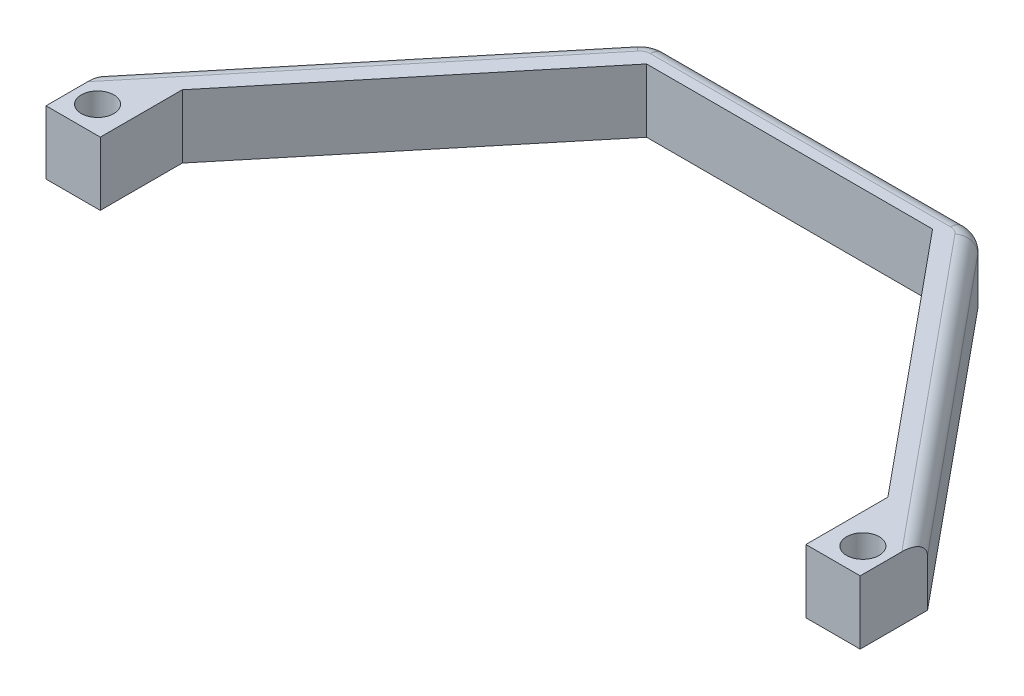
ISO-10303-21;
HEADER;
FILE_DESCRIPTION(('STEP AP214'),'2;1');
FILE_NAME('part.step','',(''),(''),'','','');
FILE_SCHEMA(('AUTOMOTIVE_DESIGN { 1 0 10303 214 1 1 1 1 }'));
ENDSEC;
DATA;
#1=APPLICATION_CONTEXT('core data for automotive mechanical design processes');
#2=APPLICATION_PROTOCOL_DEFINITION('international standard','automotive_design',2000,#1);
#3=PRODUCT_CONTEXT('',#1,'mechanical');
#4=PRODUCT('Part','Part','',(#3));
#5=PRODUCT_RELATED_PRODUCT_CATEGORY('part','',(#4));
#6=PRODUCT_DEFINITION_FORMATION('','',#4);
#7=PRODUCT_DEFINITION_CONTEXT('part definition',#1,'design');
#8=PRODUCT_DEFINITION('design','',#6,#7);
#9=PRODUCT_DEFINITION_SHAPE('','',#8);
#10=(LENGTH_UNIT() NAMED_UNIT(*) SI_UNIT(.MILLI.,.METRE.));
#11=(NAMED_UNIT(*) PLANE_ANGLE_UNIT() SI_UNIT($,.RADIAN.));
#12=(NAMED_UNIT(*) SI_UNIT($,.STERADIAN.) SOLID_ANGLE_UNIT());
#13=UNCERTAINTY_MEASURE_WITH_UNIT(LENGTH_MEASURE(1.E-05),#10,'distance_accuracy_value','');
#14=(GEOMETRIC_REPRESENTATION_CONTEXT(3) GLOBAL_UNCERTAINTY_ASSIGNED_CONTEXT((#13)) GLOBAL_UNIT_ASSIGNED_CONTEXT((#10,
#11,#12)) REPRESENTATION_CONTEXT('',''));
#15=CARTESIAN_POINT('',(0.,0.,0.));
#16=DIRECTION('',(0.,0.,1.));
#17=DIRECTION('',(1.,0.,0.));
#18=AXIS2_PLACEMENT_3D('',#15,#16,#17);
#19=CARTESIAN_POINT('',(70.5,11.7,-5.));
#20=DIRECTION('',(0.,-1.,0.));
#21=DIRECTION('',(0.,0.,-1.));
#22=AXIS2_PLACEMENT_3D('',#19,#20,#21);
#23=CYLINDRICAL_SURFACE('',#22,1.65);
#24=CARTESIAN_POINT('',(70.5,0.,-5.));
#25=DIRECTION('',(0.,1.,0.));
#26=DIRECTION('',(0.,0.,1.));
#27=AXIS2_PLACEMENT_3D('',#24,#25,#26);
#28=CIRCLE('',#27,1.65);
#29=CARTESIAN_POINT('',(70.5,0.,-3.35));
#30=VERTEX_POINT('',#29);
#31=EDGE_CURVE('E204',#30,#30,#28,.T.);
#32=ORIENTED_EDGE('',*,*,#31,.F.);
#33=EDGE_LOOP('',(#32));
#34=FACE_BOUND('',#33,.T.);
#35=CARTESIAN_POINT('',(70.5,6.,-5.));
#36=DIRECTION('',(0.,1.,0.));
#37=DIRECTION('',(0.,0.,1.));
#38=AXIS2_PLACEMENT_3D('',#35,#36,#37);
#39=CIRCLE('',#38,1.65);
#40=CARTESIAN_POINT('',(70.5,6.,-3.35));
#41=VERTEX_POINT('',#40);
#42=EDGE_CURVE('E43',#41,#41,#39,.T.);
#43=ORIENTED_EDGE('',*,*,#42,.T.);
#44=EDGE_LOOP('',(#43));
#45=FACE_BOUND('',#44,.T.);
#46=ADVANCED_FACE('F39',(#34,#45),#23,.F.);
#47=CARTESIAN_POINT('',(-70.5,11.7,-5.));
#48=DIRECTION('',(0.,-1.,0.));
#49=DIRECTION('',(0.,0.,-1.));
#50=AXIS2_PLACEMENT_3D('',#47,#48,#49);
#51=CYLINDRICAL_SURFACE('',#50,1.65);
#52=CARTESIAN_POINT('',(-70.5,0.,-5.));
#53=DIRECTION('',(0.,1.,0.));
#54=DIRECTION('',(0.,0.,1.));
#55=AXIS2_PLACEMENT_3D('',#52,#53,#54);
#56=CIRCLE('',#55,1.65);
#57=CARTESIAN_POINT('',(-70.5,0.,-3.35));
#58=VERTEX_POINT('',#57);
#59=EDGE_CURVE('E207',#58,#58,#56,.T.);
#60=ORIENTED_EDGE('',*,*,#59,.F.);
#61=EDGE_LOOP('',(#60));
#62=FACE_BOUND('',#61,.T.);
#63=CARTESIAN_POINT('',(-70.5,6.,-5.));
#64=DIRECTION('',(0.,1.,0.));
#65=DIRECTION('',(0.,0.,1.));
#66=AXIS2_PLACEMENT_3D('',#63,#64,#65);
#67=CIRCLE('',#66,1.65);
#68=CARTESIAN_POINT('',(-70.5,6.,-3.35));
#69=VERTEX_POINT('',#68);
#70=EDGE_CURVE('E272',#69,#69,#67,.T.);
#71=ORIENTED_EDGE('',*,*,#70,.T.);
#72=EDGE_LOOP('',(#71));
#73=FACE_BOUND('',#72,.T.);
#74=ADVANCED_FACE('F396',(#62,#73),#51,.F.);
#75=CARTESIAN_POINT('',(0.,11.7,0.));
#76=DIRECTION('',(0.,1.,0.));
#77=DIRECTION('',(0.,0.,1.));
#78=AXIS2_PLACEMENT_3D('',#75,#76,#77);
#79=PLANE('',#78);
#80=CARTESIAN_POINT('',(-70.5,11.7,-5.));
#81=DIRECTION('',(0.,1.,0.));
#82=DIRECTION('',(0.,0.,1.));
#83=AXIS2_PLACEMENT_3D('',#80,#81,#82);
#84=CIRCLE('',#83,3.00000000000001);
#85=CARTESIAN_POINT('',(-70.5,11.7,-1.99999999999999));
#86=VERTEX_POINT('',#85);
#87=EDGE_CURVE('E279',#86,#86,#84,.T.);
#88=ORIENTED_EDGE('',*,*,#87,.F.);
#89=EDGE_LOOP('',(#88));
#90=FACE_BOUND('',#89,.T.);
#91=CARTESIAN_POINT('',(70.5,11.7,-5.));
#92=DIRECTION('',(0.,1.,0.));
#93=DIRECTION('',(0.,0.,1.));
#94=AXIS2_PLACEMENT_3D('',#91,#92,#93);
#95=CIRCLE('',#94,3.00000000000001);
#96=CARTESIAN_POINT('',(70.5,11.7,-1.99999999999999));
#97=VERTEX_POINT('',#96);
#98=EDGE_CURVE('E287',#97,#97,#95,.T.);
#99=ORIENTED_EDGE('',*,*,#98,.F.);
#100=EDGE_LOOP('',(#99));
#101=FACE_BOUND('',#100,.T.);
#102=CARTESIAN_POINT('',(27.6418249587765,11.7,-62.));
#103=DIRECTION('',(0.,1.,0.));
#104=DIRECTION('',(0.,0.,1.));
#105=AXIS2_PLACEMENT_3D('',#102,#103,#104);
#106=CIRCLE('',#105,2.);
#107=CARTESIAN_POINT('',(27.6418249587765,11.7,-64.));
#108=VERTEX_POINT('',#107);
#109=CARTESIAN_POINT('',(29.1850832615161,11.7,-63.2721453576637));
#110=VERTEX_POINT('',#109);
#111=EDGE_CURVE('E252',#108,#110,#106,.F.);
#112=ORIENTED_EDGE('',*,*,#111,.F.);
#113=DIRECTION('',(1.,0.,0.));
#114=VECTOR('',#113,1.);
#115=CARTESIAN_POINT('',(0.,11.7,-64.));
#116=LINE('',#115,#114);
#117=CARTESIAN_POINT('',(-27.6418249587765,11.7,-64.));
#118=VERTEX_POINT('',#117);
#119=EDGE_CURVE('E231',#108,#118,#116,.F.);
#120=ORIENTED_EDGE('',*,*,#119,.T.);
#121=CARTESIAN_POINT('',(-27.6418249587765,11.7,-62.));
#122=DIRECTION('',(0.,1.,0.));
#123=DIRECTION('',(0.,0.,1.));
#124=AXIS2_PLACEMENT_3D('',#121,#122,#123);
#125=CIRCLE('',#124,2.);
#126=CARTESIAN_POINT('',(-29.1850832615161,11.7,-63.2721453576637));
#127=VERTEX_POINT('',#126);
#128=EDGE_CURVE('E250',#127,#118,#125,.F.);
#129=ORIENTED_EDGE('',*,*,#128,.F.);
#130=DIRECTION('',(0.636072678831856,0.,-0.771629151369793));
#131=VECTOR('',#130,1.);
#132=CARTESIAN_POINT('',(-48.4318777954285,11.7,-39.9235749394748));
#133=LINE('',#132,#131);
#134=CARTESIAN_POINT('',(-75.,11.7,-7.69339390442093));
#135=VERTEX_POINT('',#134);
#136=EDGE_CURVE('E237',#127,#135,#133,.F.);
#137=ORIENTED_EDGE('',*,*,#136,.T.);
#138=DIRECTION('',(0.,0.,1.));
#139=VECTOR('',#138,1.);
#140=CARTESIAN_POINT('',(-75.,11.7,0.));
#141=LINE('',#140,#139);
#142=CARTESIAN_POINT('',(-75.,11.7,0.));
#143=VERTEX_POINT('',#142);
#144=EDGE_CURVE('E215',#135,#143,#141,.T.);
#145=ORIENTED_EDGE('',*,*,#144,.T.);
#146=DIRECTION('',(-1.,0.,0.));
#147=VECTOR('',#146,1.);
#148=CARTESIAN_POINT('',(0.,11.7,0.));
#149=LINE('',#148,#147);
#150=CARTESIAN_POINT('',(-65.,11.7,0.));
#151=VERTEX_POINT('',#150);
#152=EDGE_CURVE('E210',#151,#143,#149,.T.);
#153=ORIENTED_EDGE('',*,*,#152,.F.);
#154=DIRECTION('',(0.,0.,-1.));
#155=VECTOR('',#154,1.);
#156=CARTESIAN_POINT('',(-65.,11.7,0.));
#157=LINE('',#156,#155);
#158=CARTESIAN_POINT('',(-65.,11.7,-15.1080992842517));
#159=VERTEX_POINT('',#158);
#160=EDGE_CURVE('E192',#151,#159,#157,.T.);
#161=ORIENTED_EDGE('',*,*,#160,.T.);
#162=DIRECTION('',(0.636072678831856,0.,-0.771629151369793));
#163=VECTOR('',#162,1.);
#164=CARTESIAN_POINT('',(-46.1169903413192,11.7,-38.0153569029793));
#165=LINE('',#164,#163);
#166=CARTESIAN_POINT('',(-26.3458656262075,11.7,-62.));
#167=VERTEX_POINT('',#166);
#168=EDGE_CURVE('E312',#159,#167,#165,.T.);
#169=ORIENTED_EDGE('',*,*,#168,.T.);
#170=DIRECTION('',(1.,0.,0.));
#171=VECTOR('',#170,1.);
#172=CARTESIAN_POINT('',(0.,11.7,-62.));
#173=LINE('',#172,#171);
#174=CARTESIAN_POINT('',(26.3458656262075,11.7,-62.));
#175=VERTEX_POINT('',#174);
#176=EDGE_CURVE('E309',#167,#175,#173,.T.);
#177=ORIENTED_EDGE('',*,*,#176,.T.);
#178=DIRECTION('',(-0.636072678831856,0.,-0.771629151369793));
#179=VECTOR('',#178,1.);
#180=CARTESIAN_POINT('',(46.1169903413192,11.7,-38.0153569029793));
#181=LINE('',#180,#179);
#182=CARTESIAN_POINT('',(65.,11.7,-15.1080992842517));
#183=VERTEX_POINT('',#182);
#184=EDGE_CURVE('E307',#183,#175,#181,.T.);
#185=ORIENTED_EDGE('',*,*,#184,.F.);
#186=DIRECTION('',(0.,0.,-1.));
#187=VECTOR('',#186,1.);
#188=CARTESIAN_POINT('',(65.,11.7,0.));
#189=LINE('',#188,#187);
#190=CARTESIAN_POINT('',(65.,11.7,0.));
#191=VERTEX_POINT('',#190);
#192=EDGE_CURVE('E295',#191,#183,#189,.T.);
#193=ORIENTED_EDGE('',*,*,#192,.F.);
#194=DIRECTION('',(-1.,0.,0.));
#195=VECTOR('',#194,1.);
#196=CARTESIAN_POINT('',(0.,11.7,0.));
#197=LINE('',#196,#195);
#198=CARTESIAN_POINT('',(75.,11.7,0.));
#199=VERTEX_POINT('',#198);
#200=EDGE_CURVE('E181',#199,#191,#197,.T.);
#201=ORIENTED_EDGE('',*,*,#200,.F.);
#202=DIRECTION('',(0.,0.,1.));
#203=VECTOR('',#202,1.);
#204=CARTESIAN_POINT('',(75.,11.7,0.));
#205=LINE('',#204,#203);
#206=CARTESIAN_POINT('',(75.,11.7,-7.69339390442094));
#207=VERTEX_POINT('',#206);
#208=EDGE_CURVE('E320',#207,#199,#205,.T.);
#209=ORIENTED_EDGE('',*,*,#208,.F.);
#210=DIRECTION('',(0.636072678831856,0.,0.771629151369793));
#211=VECTOR('',#210,1.);
#212=CARTESIAN_POINT('',(48.4318777954285,11.7,-39.9235749394748));
#213=LINE('',#212,#211);
#214=EDGE_CURVE('E234',#207,#110,#213,.F.);
#215=ORIENTED_EDGE('',*,*,#214,.T.);
#216=EDGE_LOOP('',(#112,#120,#129,#137,#145,#153,#161,#169,#177,#185,#193,#201,#209,#215));
#217=FACE_BOUND('',#216,.T.);
#218=ADVANCED_FACE('F324',(#90,#101,#217),#79,.T.);
#219=CARTESIAN_POINT('',(0.,11.7,0.));
#220=DIRECTION('',(0.,0.,1.));
#221=DIRECTION('',(1.,0.,0.));
#222=AXIS2_PLACEMENT_3D('',#219,#220,#221);
#223=PLANE('',#222);
#224=DIRECTION('',(-1.,0.,0.));
#225=VECTOR('',#224,1.);
#226=CARTESIAN_POINT('',(0.,0.,0.));
#227=LINE('',#226,#225);
#228=CARTESIAN_POINT('',(-65.,0.,0.));
#229=VERTEX_POINT('',#228);
#230=CARTESIAN_POINT('',(-75.,0.,0.));
#231=VERTEX_POINT('',#230);
#232=EDGE_CURVE('E188',#229,#231,#227,.T.);
#233=ORIENTED_EDGE('',*,*,#232,.F.);
#234=DIRECTION('',(0.,1.,0.));
#235=VECTOR('',#234,1.);
#236=CARTESIAN_POINT('',(-65.,-10.,0.));
#237=LINE('',#236,#235);
#238=EDGE_CURVE('E292',#229,#151,#237,.T.);
#239=ORIENTED_EDGE('',*,*,#238,.T.);
#240=ORIENTED_EDGE('',*,*,#152,.T.);
#241=DIRECTION('',(0.,-1.,0.));
#242=VECTOR('',#241,1.);
#243=CARTESIAN_POINT('',(-75.,11.7,0.));
#244=LINE('',#243,#242);
#245=EDGE_CURVE('E211',#143,#231,#244,.T.);
#246=ORIENTED_EDGE('',*,*,#245,.T.);
#247=EDGE_LOOP('',(#233,#239,#240,#246));
#248=FACE_BOUND('',#247,.T.);
#249=ADVANCED_FACE('F331',(#248),#223,.T.);
#250=CARTESIAN_POINT('',(0.,0.,0.));
#251=DIRECTION('',(0.,1.,0.));
#252=DIRECTION('',(0.,0.,1.));
#253=AXIS2_PLACEMENT_3D('',#250,#251,#252);
#254=PLANE('',#253);
#255=ORIENTED_EDGE('',*,*,#59,.T.);
#256=EDGE_LOOP('',(#255));
#257=FACE_BOUND('',#256,.T.);
#258=ORIENTED_EDGE('',*,*,#31,.T.);
#259=EDGE_LOOP('',(#258));
#260=FACE_BOUND('',#259,.T.);
#261=DIRECTION('',(0.636072678831856,0.,-0.771629151369793));
#262=VECTOR('',#261,1.);
#263=CARTESIAN_POINT('',(-50.7467652495379,0.,-41.8317929759704));
#264=LINE('',#263,#262);
#265=CARTESIAN_POINT('',(-75.,0.,-12.4098360655738));
#266=VERTEX_POINT('',#265);
#267=CARTESIAN_POINT('',(-31.4999707156255,0.,-65.1803633941593));
#268=VERTEX_POINT('',#267);
#269=EDGE_CURVE('E199',#266,#268,#264,.T.);
#270=ORIENTED_EDGE('',*,*,#269,.T.);
#271=CARTESIAN_POINT('',(-27.6418249587765,0.,-62.));
#272=DIRECTION('',(0.,1.,0.));
#273=DIRECTION('',(0.,0.,1.));
#274=AXIS2_PLACEMENT_3D('',#271,#272,#273);
#275=CIRCLE('',#274,5.);
#276=CARTESIAN_POINT('',(-27.6418249587765,0.,-67.));
#277=VERTEX_POINT('',#276);
#278=EDGE_CURVE('E262',#268,#277,#275,.F.);
#279=ORIENTED_EDGE('',*,*,#278,.T.);
#280=DIRECTION('',(1.,0.,0.));
#281=VECTOR('',#280,1.);
#282=CARTESIAN_POINT('',(0.,0.,-67.));
#283=LINE('',#282,#281);
#284=CARTESIAN_POINT('',(27.6418249587765,0.,-67.));
#285=VERTEX_POINT('',#284);
#286=EDGE_CURVE('E197',#277,#285,#283,.T.);
#287=ORIENTED_EDGE('',*,*,#286,.T.);
#288=CARTESIAN_POINT('',(27.6418249587765,0.,-62.));
#289=DIRECTION('',(0.,1.,0.));
#290=DIRECTION('',(0.,0.,1.));
#291=AXIS2_PLACEMENT_3D('',#288,#289,#290);
#292=CIRCLE('',#291,5.);
#293=CARTESIAN_POINT('',(31.4999707156255,0.,-65.1803633941593));
#294=VERTEX_POINT('',#293);
#295=EDGE_CURVE('E56',#285,#294,#292,.F.);
#296=ORIENTED_EDGE('',*,*,#295,.T.);
#297=DIRECTION('',(0.636072678831856,0.,0.771629151369793));
#298=VECTOR('',#297,1.);
#299=CARTESIAN_POINT('',(50.7467652495379,0.,-41.8317929759704));
#300=LINE('',#299,#298);
#301=CARTESIAN_POINT('',(75.,0.,-12.4098360655738));
#302=VERTEX_POINT('',#301);
#303=EDGE_CURVE('E190',#294,#302,#300,.T.);
#304=ORIENTED_EDGE('',*,*,#303,.T.);
#305=DIRECTION('',(0.,0.,1.));
#306=VECTOR('',#305,1.);
#307=CARTESIAN_POINT('',(75.,0.,0.));
#308=LINE('',#307,#306);
#309=CARTESIAN_POINT('',(75.,0.,0.));
#310=VERTEX_POINT('',#309);
#311=EDGE_CURVE('E187',#302,#310,#308,.T.);
#312=ORIENTED_EDGE('',*,*,#311,.T.);
#313=DIRECTION('',(-1.,0.,0.));
#314=VECTOR('',#313,1.);
#315=CARTESIAN_POINT('',(0.,0.,0.));
#316=LINE('',#315,#314);
#317=CARTESIAN_POINT('',(65.,0.,0.));
#318=VERTEX_POINT('',#317);
#319=EDGE_CURVE('E178',#310,#318,#316,.T.);
#320=ORIENTED_EDGE('',*,*,#319,.T.);
#321=DIRECTION('',(0.,0.,-1.));
#322=VECTOR('',#321,1.);
#323=CARTESIAN_POINT('',(65.,0.,0.));
#324=LINE('',#323,#322);
#325=CARTESIAN_POINT('',(65.,0.,-15.1080992842517));
#326=VERTEX_POINT('',#325);
#327=EDGE_CURVE('E160',#318,#326,#324,.T.);
#328=ORIENTED_EDGE('',*,*,#327,.T.);
#329=DIRECTION('',(-0.636072678831856,0.,-0.771629151369793));
#330=VECTOR('',#329,1.);
#331=CARTESIAN_POINT('',(46.1169903413192,0.,-38.0153569029793));
#332=LINE('',#331,#330);
#333=CARTESIAN_POINT('',(26.3458656262075,0.,-62.));
#334=VERTEX_POINT('',#333);
#335=EDGE_CURVE('E170',#326,#334,#332,.T.);
#336=ORIENTED_EDGE('',*,*,#335,.T.);
#337=DIRECTION('',(1.,0.,0.));
#338=VECTOR('',#337,1.);
#339=CARTESIAN_POINT('',(0.,0.,-62.));
#340=LINE('',#339,#338);
#341=CARTESIAN_POINT('',(-26.3458656262075,0.,-62.));
#342=VERTEX_POINT('',#341);
#343=EDGE_CURVE('E222',#342,#334,#340,.T.);
#344=ORIENTED_EDGE('',*,*,#343,.F.);
#345=DIRECTION('',(0.636072678831856,0.,-0.771629151369793));
#346=VECTOR('',#345,1.);
#347=CARTESIAN_POINT('',(-46.1169903413192,0.,-38.0153569029793));
#348=LINE('',#347,#346);
#349=CARTESIAN_POINT('',(-65.,0.,-15.1080992842517));
#350=VERTEX_POINT('',#349);
#351=EDGE_CURVE('E224',#350,#342,#348,.T.);
#352=ORIENTED_EDGE('',*,*,#351,.F.);
#353=DIRECTION('',(0.,0.,-1.));
#354=VECTOR('',#353,1.);
#355=CARTESIAN_POINT('',(-65.,0.,0.));
#356=LINE('',#355,#354);
#357=EDGE_CURVE('E226',#229,#350,#356,.T.);
#358=ORIENTED_EDGE('',*,*,#357,.F.);
#359=ORIENTED_EDGE('',*,*,#232,.T.);
#360=DIRECTION('',(0.,0.,1.));
#361=VECTOR('',#360,1.);
#362=CARTESIAN_POINT('',(-75.,0.,0.));
#363=LINE('',#362,#361);
#364=EDGE_CURVE('E201',#266,#231,#363,.T.);
#365=ORIENTED_EDGE('',*,*,#364,.F.);
#366=EDGE_LOOP('',(#270,#279,#287,#296,#304,#312,#320,#328,#336,#344,#352,#358,#359,#365));
#367=FACE_BOUND('',#366,.T.);
#368=ADVANCED_FACE('F185',(#257,#260,#367),#254,.F.);
#369=CARTESIAN_POINT('',(0.,11.7,0.));
#370=DIRECTION('',(0.,0.,1.));
#371=DIRECTION('',(1.,0.,0.));
#372=AXIS2_PLACEMENT_3D('',#369,#370,#371);
#373=PLANE('',#372);
#374=DIRECTION('',(0.,1.,0.));
#375=VECTOR('',#374,1.);
#376=CARTESIAN_POINT('',(65.,-10.,0.));
#377=LINE('',#376,#375);
#378=EDGE_CURVE('E163',#318,#191,#377,.T.);
#379=ORIENTED_EDGE('',*,*,#378,.F.);
#380=ORIENTED_EDGE('',*,*,#319,.F.);
#381=DIRECTION('',(0.,-1.,0.));
#382=VECTOR('',#381,1.);
#383=CARTESIAN_POINT('',(75.,11.7,0.));
#384=LINE('',#383,#382);
#385=EDGE_CURVE('E171',#199,#310,#384,.T.);
#386=ORIENTED_EDGE('',*,*,#385,.F.);
#387=ORIENTED_EDGE('',*,*,#200,.T.);
#388=EDGE_LOOP('',(#379,#380,#386,#387));
#389=FACE_BOUND('',#388,.T.);
#390=ADVANCED_FACE('F176',(#389),#373,.T.);
#391=CARTESIAN_POINT('',(75.,11.7,0.));
#392=DIRECTION('',(1.,0.,0.));
#393=DIRECTION('',(0.,0.,-1.));
#394=AXIS2_PLACEMENT_3D('',#391,#392,#393);
#395=PLANE('',#394);
#396=DIRECTION('',(0.,-1.,0.));
#397=VECTOR('',#396,1.);
#398=CARTESIAN_POINT('',(75.,11.7,-12.4098360655738));
#399=LINE('',#398,#397);
#400=CARTESIAN_POINT('',(75.,8.7,-12.4098360655738));
#401=VERTEX_POINT('',#400);
#402=EDGE_CURVE('E217',#401,#302,#399,.T.);
#403=ORIENTED_EDGE('',*,*,#402,.F.);
#404=CARTESIAN_POINT('',(75.,8.7,-7.69339390442092));
#405=DIRECTION('',(1.,0.,0.));
#406=DIRECTION('',(0.,0.,1.));
#407=AXIS2_PLACEMENT_3D('',#404,#405,#406);
#408=ELLIPSE('',#407,4.71644216115285,3.);
#409=EDGE_CURVE('E243',#401,#207,#408,.T.);
#410=ORIENTED_EDGE('',*,*,#409,.T.);
#411=ORIENTED_EDGE('',*,*,#208,.T.);
#412=ORIENTED_EDGE('',*,*,#385,.T.);
#413=ORIENTED_EDGE('',*,*,#311,.F.);
#414=EDGE_LOOP('',(#403,#410,#411,#412,#413));
#415=FACE_BOUND('',#414,.T.);
#416=ADVANCED_FACE('F371',(#415),#395,.T.);
#417=CARTESIAN_POINT('',(50.7467652495379,11.7,-41.8317929759704));
#418=DIRECTION('',(0.771629151369793,0.,-0.636072678831856));
#419=DIRECTION('',(-0.636072678831856,0.,-0.771629151369793));
#420=AXIS2_PLACEMENT_3D('',#417,#418,#419);
#421=PLANE('',#420);
#422=ORIENTED_EDGE('',*,*,#303,.F.);
#423=DIRECTION('',(0.,-1.,0.));
#424=VECTOR('',#423,1.);
#425=CARTESIAN_POINT('',(31.4999707156255,11.7,-65.1803633941593));
#426=LINE('',#425,#424);
#427=CARTESIAN_POINT('',(31.4999707156254,8.7,-65.1803633941593));
#428=VERTEX_POINT('',#427);
#429=EDGE_CURVE('E48',#294,#428,#426,.F.);
#430=ORIENTED_EDGE('',*,*,#429,.T.);
#431=DIRECTION('',(0.636072678831856,0.,0.771629151369793));
#432=VECTOR('',#431,1.);
#433=CARTESIAN_POINT('',(50.7467652495379,8.7,-41.8317929759704));
#434=LINE('',#433,#432);
#435=EDGE_CURVE('E241',#428,#401,#434,.T.);
#436=ORIENTED_EDGE('',*,*,#435,.T.);
#437=ORIENTED_EDGE('',*,*,#402,.T.);
#438=EDGE_LOOP('',(#422,#430,#436,#437));
#439=FACE_BOUND('',#438,.T.);
#440=ADVANCED_FACE('F369',(#439),#421,.T.);
#441=CARTESIAN_POINT('',(0.,11.7,-67.));
#442=DIRECTION('',(0.,0.,-1.));
#443=DIRECTION('',(-1.,0.,0.));
#444=AXIS2_PLACEMENT_3D('',#441,#442,#443);
#445=PLANE('',#444);
#446=ORIENTED_EDGE('',*,*,#286,.F.);
#447=DIRECTION('',(0.,-1.,0.));
#448=VECTOR('',#447,1.);
#449=CARTESIAN_POINT('',(-27.6418249587765,11.7,-67.));
#450=LINE('',#449,#448);
#451=CARTESIAN_POINT('',(-27.6418249587765,8.7,-67.));
#452=VERTEX_POINT('',#451);
#453=EDGE_CURVE('E265',#277,#452,#450,.F.);
#454=ORIENTED_EDGE('',*,*,#453,.T.);
#455=DIRECTION('',(1.,0.,0.));
#456=VECTOR('',#455,1.);
#457=CARTESIAN_POINT('',(0.,8.7,-67.));
#458=LINE('',#457,#456);
#459=CARTESIAN_POINT('',(27.6418249587765,8.7,-67.));
#460=VERTEX_POINT('',#459);
#461=EDGE_CURVE('E245',#452,#460,#458,.T.);
#462=ORIENTED_EDGE('',*,*,#461,.T.);
#463=DIRECTION('',(0.,-1.,0.));
#464=VECTOR('',#463,1.);
#465=CARTESIAN_POINT('',(27.6418249587765,11.7,-67.));
#466=LINE('',#465,#464);
#467=EDGE_CURVE('E64',#460,#285,#466,.T.);
#468=ORIENTED_EDGE('',*,*,#467,.T.);
#469=EDGE_LOOP('',(#446,#454,#462,#468));
#470=FACE_BOUND('',#469,.T.);
#471=ADVANCED_FACE('F411',(#470),#445,.T.);
#472=CARTESIAN_POINT('',(-50.7467652495379,11.7,-41.8317929759704));
#473=DIRECTION('',(-0.771629151369793,0.,-0.636072678831856));
#474=DIRECTION('',(-0.636072678831856,0.,0.771629151369793));
#475=AXIS2_PLACEMENT_3D('',#472,#473,#474);
#476=PLANE('',#475);
#477=DIRECTION('',(0.636072678831856,0.,-0.771629151369793));
#478=VECTOR('',#477,1.);
#479=CARTESIAN_POINT('',(-50.7467652495379,8.7,-41.8317929759704));
#480=LINE('',#479,#478);
#481=CARTESIAN_POINT('',(-75.,8.7,-12.4098360655738));
#482=VERTEX_POINT('',#481);
#483=CARTESIAN_POINT('',(-31.4999707156254,8.7,-65.1803633941593));
#484=VERTEX_POINT('',#483);
#485=EDGE_CURVE('E228',#482,#484,#480,.T.);
#486=ORIENTED_EDGE('',*,*,#485,.T.);
#487=DIRECTION('',(0.,-1.,0.));
#488=VECTOR('',#487,1.);
#489=CARTESIAN_POINT('',(-31.4999707156255,11.7,-65.1803633941593));
#490=LINE('',#489,#488);
#491=EDGE_CURVE('E259',#484,#268,#490,.T.);
#492=ORIENTED_EDGE('',*,*,#491,.T.);
#493=ORIENTED_EDGE('',*,*,#269,.F.);
#494=DIRECTION('',(0.,-1.,0.));
#495=VECTOR('',#494,1.);
#496=CARTESIAN_POINT('',(-75.,11.7,-12.4098360655738));
#497=LINE('',#496,#495);
#498=EDGE_CURVE('E214',#482,#266,#497,.T.);
#499=ORIENTED_EDGE('',*,*,#498,.F.);
#500=EDGE_LOOP('',(#486,#492,#493,#499));
#501=FACE_BOUND('',#500,.T.);
#502=ADVANCED_FACE('F339',(#501),#476,.T.);
#503=CARTESIAN_POINT('',(-75.,11.7,0.));
#504=DIRECTION('',(1.,0.,0.));
#505=DIRECTION('',(0.,0.,-1.));
#506=AXIS2_PLACEMENT_3D('',#503,#504,#505);
#507=PLANE('',#506);
#508=ORIENTED_EDGE('',*,*,#144,.F.);
#509=CARTESIAN_POINT('',(-75.,8.7,-7.69339390442092));
#510=DIRECTION('',(1.,0.,0.));
#511=DIRECTION('',(0.,0.,-1.));
#512=AXIS2_PLACEMENT_3D('',#509,#510,#511);
#513=ELLIPSE('',#512,4.71644216115285,3.);
#514=EDGE_CURVE('E239',#135,#482,#513,.F.);
#515=ORIENTED_EDGE('',*,*,#514,.T.);
#516=ORIENTED_EDGE('',*,*,#498,.T.);
#517=ORIENTED_EDGE('',*,*,#364,.T.);
#518=ORIENTED_EDGE('',*,*,#245,.F.);
#519=EDGE_LOOP('',(#508,#515,#516,#517,#518));
#520=FACE_BOUND('',#519,.T.);
#521=ADVANCED_FACE('F332',(#520),#507,.F.);
#522=CARTESIAN_POINT('',(-65.,-10.,0.));
#523=DIRECTION('',(1.,0.,0.));
#524=DIRECTION('',(0.,0.,-1.));
#525=AXIS2_PLACEMENT_3D('',#522,#523,#524);
#526=PLANE('',#525);
#527=ORIENTED_EDGE('',*,*,#238,.F.);
#528=ORIENTED_EDGE('',*,*,#357,.T.);
#529=DIRECTION('',(0.,1.,0.));
#530=VECTOR('',#529,1.);
#531=CARTESIAN_POINT('',(-65.,-10.,-15.1080992842517));
#532=LINE('',#531,#530);
#533=EDGE_CURVE('E296',#350,#159,#532,.T.);
#534=ORIENTED_EDGE('',*,*,#533,.T.);
#535=ORIENTED_EDGE('',*,*,#160,.F.);
#536=EDGE_LOOP('',(#527,#528,#534,#535));
#537=FACE_BOUND('',#536,.T.);
#538=ADVANCED_FACE('F385',(#537),#526,.T.);
#539=CARTESIAN_POINT('',(-46.1169903413192,-10.,-38.0153569029793));
#540=DIRECTION('',(0.771629151369793,0.,0.636072678831856));
#541=DIRECTION('',(0.636072678831856,0.,-0.771629151369793));
#542=AXIS2_PLACEMENT_3D('',#539,#540,#541);
#543=PLANE('',#542);
#544=ORIENTED_EDGE('',*,*,#533,.F.);
#545=ORIENTED_EDGE('',*,*,#351,.T.);
#546=DIRECTION('',(0.,1.,0.));
#547=VECTOR('',#546,1.);
#548=CARTESIAN_POINT('',(-26.3458656262075,-10.,-62.));
#549=LINE('',#548,#547);
#550=EDGE_CURVE('E299',#342,#167,#549,.T.);
#551=ORIENTED_EDGE('',*,*,#550,.T.);
#552=ORIENTED_EDGE('',*,*,#168,.F.);
#553=EDGE_LOOP('',(#544,#545,#551,#552));
#554=FACE_BOUND('',#553,.T.);
#555=ADVANCED_FACE('F383',(#554),#543,.T.);
#556=CARTESIAN_POINT('',(0.,-10.,-62.));
#557=DIRECTION('',(0.,0.,1.));
#558=DIRECTION('',(1.,0.,0.));
#559=AXIS2_PLACEMENT_3D('',#556,#557,#558);
#560=PLANE('',#559);
#561=ORIENTED_EDGE('',*,*,#550,.F.);
#562=ORIENTED_EDGE('',*,*,#343,.T.);
#563=DIRECTION('',(0.,1.,0.));
#564=VECTOR('',#563,1.);
#565=CARTESIAN_POINT('',(26.3458656262075,-10.,-62.));
#566=LINE('',#565,#564);
#567=EDGE_CURVE('E302',#334,#175,#566,.T.);
#568=ORIENTED_EDGE('',*,*,#567,.T.);
#569=ORIENTED_EDGE('',*,*,#176,.F.);
#570=EDGE_LOOP('',(#561,#562,#568,#569));
#571=FACE_BOUND('',#570,.T.);
#572=ADVANCED_FACE('F380',(#571),#560,.T.);
#573=CARTESIAN_POINT('',(46.1169903413192,-10.,-38.0153569029793));
#574=DIRECTION('',(0.771629151369793,0.,-0.636072678831856));
#575=DIRECTION('',(-0.636072678831856,0.,-0.771629151369793));
#576=AXIS2_PLACEMENT_3D('',#573,#574,#575);
#577=PLANE('',#576);
#578=ORIENTED_EDGE('',*,*,#184,.T.);
#579=ORIENTED_EDGE('',*,*,#567,.F.);
#580=ORIENTED_EDGE('',*,*,#335,.F.);
#581=DIRECTION('',(0.,1.,0.));
#582=VECTOR('',#581,1.);
#583=CARTESIAN_POINT('',(65.,-10.,-15.1080992842517));
#584=LINE('',#583,#582);
#585=EDGE_CURVE('E166',#326,#183,#584,.T.);
#586=ORIENTED_EDGE('',*,*,#585,.T.);
#587=EDGE_LOOP('',(#578,#579,#580,#586));
#588=FACE_BOUND('',#587,.T.);
#589=ADVANCED_FACE('F374',(#588),#577,.F.);
#590=CARTESIAN_POINT('',(65.,-10.,0.));
#591=DIRECTION('',(1.,0.,0.));
#592=DIRECTION('',(0.,0.,-1.));
#593=AXIS2_PLACEMENT_3D('',#590,#591,#592);
#594=PLANE('',#593);
#595=ORIENTED_EDGE('',*,*,#192,.T.);
#596=ORIENTED_EDGE('',*,*,#585,.F.);
#597=ORIENTED_EDGE('',*,*,#327,.F.);
#598=ORIENTED_EDGE('',*,*,#378,.T.);
#599=EDGE_LOOP('',(#595,#596,#597,#598));
#600=FACE_BOUND('',#599,.T.);
#601=ADVANCED_FACE('F162',(#600),#594,.F.);
#602=CARTESIAN_POINT('',(48.4318777954285,8.7,-39.9235749394748));
#603=DIRECTION('',(0.636072678831856,0.,0.771629151369793));
#604=DIRECTION('',(0.771629151369793,0.,-0.636072678831856));
#605=AXIS2_PLACEMENT_3D('',#602,#603,#604);
#606=CYLINDRICAL_SURFACE('',#605,3.);
#607=ORIENTED_EDGE('',*,*,#435,.F.);
#608=CARTESIAN_POINT('',(29.1850832615161,8.7,-63.2721453576637));
#609=DIRECTION('',(0.636072678831857,0.,0.771629151369792));
#610=DIRECTION('',(0.771629151369792,0.,-0.636072678831857));
#611=AXIS2_PLACEMENT_3D('',#608,#609,#610);
#612=CIRCLE('',#611,3.);
#613=EDGE_CURVE('E247',#428,#110,#612,.T.);
#614=ORIENTED_EDGE('',*,*,#613,.T.);
#615=ORIENTED_EDGE('',*,*,#214,.F.);
#616=ORIENTED_EDGE('',*,*,#409,.F.);
#617=EDGE_LOOP('',(#607,#614,#615,#616));
#618=FACE_BOUND('',#617,.T.);
#619=ADVANCED_FACE('F361',(#618),#606,.T.);
#620=CARTESIAN_POINT('',(0.,8.7,-64.));
#621=DIRECTION('',(1.,0.,0.));
#622=DIRECTION('',(0.,0.,-1.));
#623=AXIS2_PLACEMENT_3D('',#620,#621,#622);
#624=CYLINDRICAL_SURFACE('',#623,3.);
#625=ORIENTED_EDGE('',*,*,#461,.F.);
#626=CARTESIAN_POINT('',(-27.6418249587765,8.7,-64.));
#627=DIRECTION('',(1.,0.,0.));
#628=DIRECTION('',(0.,0.,-1.));
#629=AXIS2_PLACEMENT_3D('',#626,#627,#628);
#630=CIRCLE('',#629,3.);
#631=EDGE_CURVE('E256',#452,#118,#630,.T.);
#632=ORIENTED_EDGE('',*,*,#631,.T.);
#633=ORIENTED_EDGE('',*,*,#119,.F.);
#634=CARTESIAN_POINT('',(27.6418249587765,8.7,-64.));
#635=DIRECTION('',(-1.,0.,0.));
#636=DIRECTION('',(0.,0.,1.));
#637=AXIS2_PLACEMENT_3D('',#634,#635,#636);
#638=CIRCLE('',#637,3.);
#639=EDGE_CURVE('E254',#108,#460,#638,.T.);
#640=ORIENTED_EDGE('',*,*,#639,.T.);
#641=EDGE_LOOP('',(#625,#632,#633,#640));
#642=FACE_BOUND('',#641,.T.);
#643=ADVANCED_FACE('F352',(#642),#624,.T.);
#644=CARTESIAN_POINT('',(-48.4318777954285,8.7,-39.9235749394748));
#645=DIRECTION('',(0.636072678831856,0.,-0.771629151369793));
#646=DIRECTION('',(-0.771629151369793,0.,-0.636072678831856));
#647=AXIS2_PLACEMENT_3D('',#644,#645,#646);
#648=CYLINDRICAL_SURFACE('',#647,3.);
#649=ORIENTED_EDGE('',*,*,#136,.F.);
#650=CARTESIAN_POINT('',(-29.1850832615161,8.7,-63.2721453576637));
#651=DIRECTION('',(-0.636072678831857,0.,0.771629151369792));
#652=DIRECTION('',(0.771629151369792,0.,0.636072678831857));
#653=AXIS2_PLACEMENT_3D('',#650,#651,#652);
#654=CIRCLE('',#653,3.);
#655=EDGE_CURVE('E12',#127,#484,#654,.T.);
#656=ORIENTED_EDGE('',*,*,#655,.T.);
#657=ORIENTED_EDGE('',*,*,#485,.F.);
#658=ORIENTED_EDGE('',*,*,#514,.F.);
#659=EDGE_LOOP('',(#649,#656,#657,#658));
#660=FACE_BOUND('',#659,.T.);
#661=ADVANCED_FACE('F422',(#660),#648,.T.);
#662=CARTESIAN_POINT('',(27.6418249587765,11.7,-62.));
#663=DIRECTION('',(0.,-1.,0.));
#664=DIRECTION('',(0.,0.,-1.));
#665=AXIS2_PLACEMENT_3D('',#662,#663,#664);
#666=CYLINDRICAL_SURFACE('',#665,5.);
#667=ORIENTED_EDGE('',*,*,#295,.F.);
#668=ORIENTED_EDGE('',*,*,#467,.F.);
#669=CARTESIAN_POINT('',(27.6418249587765,8.7,-62.));
#670=DIRECTION('',(0.,1.,0.));
#671=DIRECTION('',(0.,0.,1.));
#672=AXIS2_PLACEMENT_3D('',#669,#670,#671);
#673=CIRCLE('',#672,5.);
#674=EDGE_CURVE('E182',#428,#460,#673,.T.);
#675=ORIENTED_EDGE('',*,*,#674,.F.);
#676=ORIENTED_EDGE('',*,*,#429,.F.);
#677=EDGE_LOOP('',(#667,#668,#675,#676));
#678=FACE_BOUND('',#677,.T.);
#679=ADVANCED_FACE('F368',(#678),#666,.T.);
#680=CARTESIAN_POINT('',(27.6418249587765,8.7,-62.));
#681=DIRECTION('',(0.,1.,0.));
#682=DIRECTION('',(0.,0.,1.));
#683=AXIS2_PLACEMENT_3D('',#680,#681,#682);
#684=DEGENERATE_TOROIDAL_SURFACE('',#683,2.,3.,.T.);
#685=ORIENTED_EDGE('',*,*,#613,.F.);
#686=ORIENTED_EDGE('',*,*,#674,.T.);
#687=ORIENTED_EDGE('',*,*,#639,.F.);
#688=ORIENTED_EDGE('',*,*,#111,.T.);
#689=EDGE_LOOP('',(#685,#686,#687,#688));
#690=FACE_BOUND('',#689,.T.);
#691=ADVANCED_FACE('F358',(#690),#684,.T.);
#692=CARTESIAN_POINT('',(-27.6418249587765,11.7,-62.));
#693=DIRECTION('',(0.,-1.,0.));
#694=DIRECTION('',(0.,0.,-1.));
#695=AXIS2_PLACEMENT_3D('',#692,#693,#694);
#696=CYLINDRICAL_SURFACE('',#695,5.);
#697=ORIENTED_EDGE('',*,*,#278,.F.);
#698=ORIENTED_EDGE('',*,*,#491,.F.);
#699=CARTESIAN_POINT('',(-27.6418249587765,8.7,-62.));
#700=DIRECTION('',(0.,1.,0.));
#701=DIRECTION('',(0.,0.,1.));
#702=AXIS2_PLACEMENT_3D('',#699,#700,#701);
#703=CIRCLE('',#702,5.);
#704=EDGE_CURVE('E270',#452,#484,#703,.T.);
#705=ORIENTED_EDGE('',*,*,#704,.F.);
#706=ORIENTED_EDGE('',*,*,#453,.F.);
#707=EDGE_LOOP('',(#697,#698,#705,#706));
#708=FACE_BOUND('',#707,.T.);
#709=ADVANCED_FACE('F41',(#708),#696,.T.);
#710=CARTESIAN_POINT('',(-27.6418249587765,8.7,-62.));
#711=DIRECTION('',(0.,1.,0.));
#712=DIRECTION('',(0.,0.,1.));
#713=AXIS2_PLACEMENT_3D('',#710,#711,#712);
#714=DEGENERATE_TOROIDAL_SURFACE('',#713,2.,3.,.T.);
#715=ORIENTED_EDGE('',*,*,#631,.F.);
#716=ORIENTED_EDGE('',*,*,#704,.T.);
#717=ORIENTED_EDGE('',*,*,#655,.F.);
#718=ORIENTED_EDGE('',*,*,#128,.T.);
#719=EDGE_LOOP('',(#715,#716,#717,#718));
#720=FACE_BOUND('',#719,.T.);
#721=ADVANCED_FACE('F348',(#720),#714,.T.);
#722=CARTESIAN_POINT('',(-70.5,-8.48528137423858,-5.));
#723=DIRECTION('',(0.,1.,0.));
#724=DIRECTION('',(0.,0.,1.));
#725=AXIS2_PLACEMENT_3D('',#722,#723,#724);
#726=CYLINDRICAL_SURFACE('',#725,3.00000000000001);
#727=CARTESIAN_POINT('',(-70.5,6.,-5.));
#728=DIRECTION('',(0.,1.,0.));
#729=DIRECTION('',(0.,0.,1.));
#730=AXIS2_PLACEMENT_3D('',#727,#728,#729);
#731=CIRCLE('',#730,3.00000000000001);
#732=CARTESIAN_POINT('',(-70.5,6.,-1.99999999999999));
#733=VERTEX_POINT('',#732);
#734=EDGE_CURVE('E274',#733,#733,#731,.F.);
#735=ORIENTED_EDGE('',*,*,#734,.T.);
#736=EDGE_LOOP('',(#735));
#737=FACE_BOUND('',#736,.T.);
#738=ORIENTED_EDGE('',*,*,#87,.T.);
#739=EDGE_LOOP('',(#738));
#740=FACE_BOUND('',#739,.T.);
#741=ADVANCED_FACE('F434',(#737,#740),#726,.F.);
#742=CARTESIAN_POINT('',(0.,6.,0.));
#743=DIRECTION('',(0.,1.,0.));
#744=DIRECTION('',(0.,0.,1.));
#745=AXIS2_PLACEMENT_3D('',#742,#743,#744);
#746=PLANE('',#745);
#747=ORIENTED_EDGE('',*,*,#70,.F.);
#748=EDGE_LOOP('',(#747));
#749=FACE_BOUND('',#748,.T.);
#750=ORIENTED_EDGE('',*,*,#734,.F.);
#751=EDGE_LOOP('',(#750));
#752=FACE_BOUND('',#751,.T.);
#753=ADVANCED_FACE('F439',(#749,#752),#746,.T.);
#754=CARTESIAN_POINT('',(70.5,-8.48528137423858,-5.));
#755=DIRECTION('',(0.,1.,0.));
#756=DIRECTION('',(0.,0.,1.));
#757=AXIS2_PLACEMENT_3D('',#754,#755,#756);
#758=CYLINDRICAL_SURFACE('',#757,3.00000000000001);
#759=CARTESIAN_POINT('',(70.5,6.,-5.));
#760=DIRECTION('',(0.,1.,0.));
#761=DIRECTION('',(0.,0.,1.));
#762=AXIS2_PLACEMENT_3D('',#759,#760,#761);
#763=CIRCLE('',#762,3.00000000000001);
#764=CARTESIAN_POINT('',(70.5,6.,-1.99999999999999));
#765=VERTEX_POINT('',#764);
#766=EDGE_CURVE('E284',#765,#765,#763,.F.);
#767=ORIENTED_EDGE('',*,*,#766,.T.);
#768=EDGE_LOOP('',(#767));
#769=FACE_BOUND('',#768,.T.);
#770=ORIENTED_EDGE('',*,*,#98,.T.);
#771=EDGE_LOOP('',(#770));
#772=FACE_BOUND('',#771,.T.);
#773=ADVANCED_FACE('F556',(#769,#772),#758,.F.);
#774=CARTESIAN_POINT('',(0.,6.,0.));
#775=DIRECTION('',(0.,1.,0.));
#776=DIRECTION('',(0.,0.,1.));
#777=AXIS2_PLACEMENT_3D('',#774,#775,#776);
#778=PLANE('',#777);
#779=ORIENTED_EDGE('',*,*,#42,.F.);
#780=EDGE_LOOP('',(#779));
#781=FACE_BOUND('',#780,.T.);
#782=ORIENTED_EDGE('',*,*,#766,.F.);
#783=EDGE_LOOP('',(#782));
#784=FACE_BOUND('',#783,.T.);
#785=ADVANCED_FACE('F558',(#781,#784),#778,.T.);
#786=CLOSED_SHELL('',(#46,#74,#218,#249,#368,#390,#416,#440,#471,#502,#521,#538,#555,#572,#589,
#601,#619,#643,#661,#679,#691,#709,#721,#741,#753,#773,#785));
#787=MANIFOLD_SOLID_BREP('B2',#786);
#788=ADVANCED_BREP_SHAPE_REPRESENTATION('',(#18,#787),#14);
#789=SHAPE_DEFINITION_REPRESENTATION(#9,#788);
ENDSEC;
END-ISO-10303-21;
